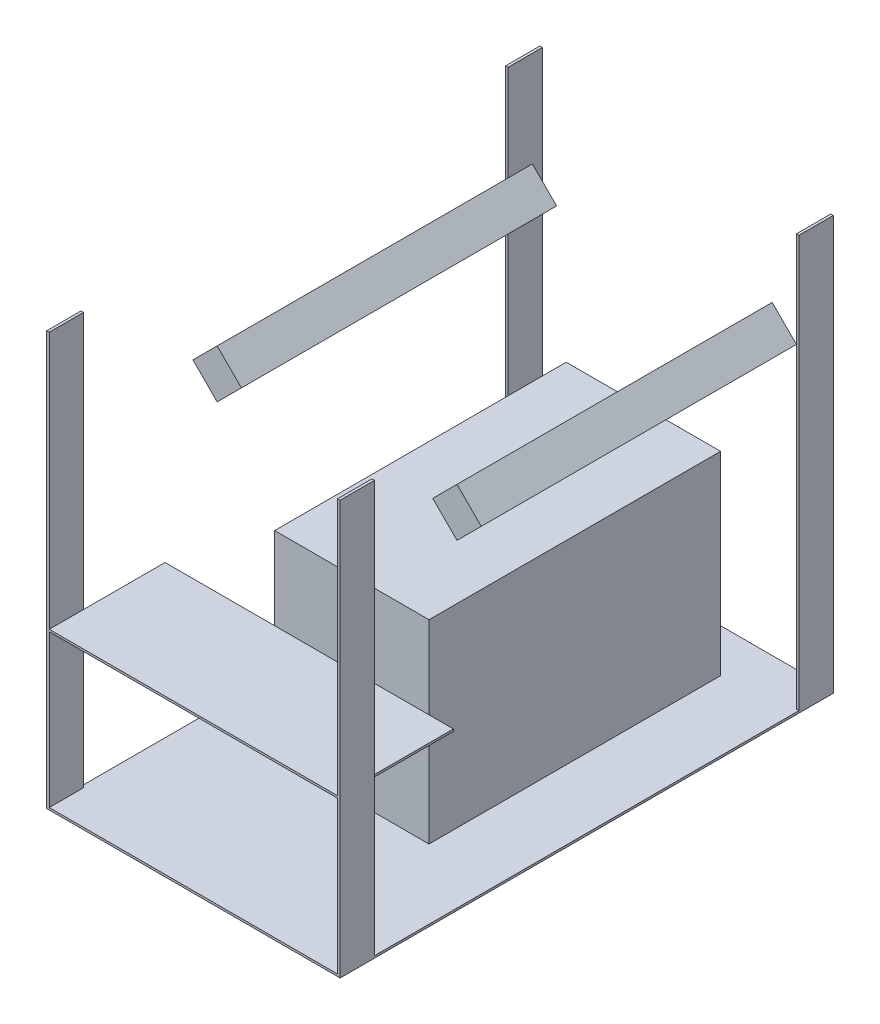
ISO-10303-21;
HEADER;
FILE_DESCRIPTION(('STEP AP214'),'2;1');
FILE_NAME('part.step','',(''),(''),'','','');
FILE_SCHEMA(('AUTOMOTIVE_DESIGN { 1 0 10303 214 1 1 1 1 }'));
ENDSEC;
DATA;
#1=APPLICATION_CONTEXT('core data for automotive mechanical design processes');
#2=APPLICATION_PROTOCOL_DEFINITION('international standard','automotive_design',2000,#1);
#3=PRODUCT_CONTEXT('',#1,'mechanical');
#4=PRODUCT('Part','Part','',(#3));
#5=PRODUCT_RELATED_PRODUCT_CATEGORY('part','',(#4));
#6=PRODUCT_DEFINITION_FORMATION('','',#4);
#7=PRODUCT_DEFINITION_CONTEXT('part definition',#1,'design');
#8=PRODUCT_DEFINITION('design','',#6,#7);
#9=PRODUCT_DEFINITION_SHAPE('','',#8);
#10=(LENGTH_UNIT() NAMED_UNIT(*) SI_UNIT(.MILLI.,.METRE.));
#11=(NAMED_UNIT(*) PLANE_ANGLE_UNIT() SI_UNIT($,.RADIAN.));
#12=(NAMED_UNIT(*) SI_UNIT($,.STERADIAN.) SOLID_ANGLE_UNIT());
#13=UNCERTAINTY_MEASURE_WITH_UNIT(LENGTH_MEASURE(1.E-05),#10,'distance_accuracy_value','');
#14=(GEOMETRIC_REPRESENTATION_CONTEXT(3) GLOBAL_UNCERTAINTY_ASSIGNED_CONTEXT((#13)) GLOBAL_UNIT_ASSIGNED_CONTEXT((#10,
#11,#12)) REPRESENTATION_CONTEXT('',''));
#15=CARTESIAN_POINT('',(0.,0.,0.));
#16=DIRECTION('',(0.,0.,1.));
#17=DIRECTION('',(1.,0.,0.));
#18=AXIS2_PLACEMENT_3D('',#15,#16,#17);
#19=CARTESIAN_POINT('',(217.297,612.775,-314.325));
#20=DIRECTION('',(0.,0.,-1.));
#21=DIRECTION('',(-1.,0.,0.));
#22=AXIS2_PLACEMENT_3D('',#19,#20,#21);
#23=PLANE('',#22);
#24=DIRECTION('',(0.707106781186552,0.707106781186543,0.));
#25=VECTOR('',#24,1.);
#26=CARTESIAN_POINT('',(-141.644951031447,470.896024484276,-314.325));
#27=LINE('',#26,#25);
#28=CARTESIAN_POINT('',(-177.565975515723,434.975,-314.325));
#29=VERTEX_POINT('',#28);
#30=CARTESIAN_POINT('',(-141.644951031447,470.896024484276,-314.325));
#31=VERTEX_POINT('',#30);
#32=EDGE_CURVE('E72',#29,#31,#27,.T.);
#33=ORIENTED_EDGE('',*,*,#32,.F.);
#34=DIRECTION('',(0.707106781186543,-0.707106781186552,0.));
#35=VECTOR('',#34,1.);
#36=CARTESIAN_POINT('',(-177.565975515723,434.975,-314.325));
#37=LINE('',#36,#35);
#38=CARTESIAN_POINT('',(-213.487,470.896024484277,-314.325));
#39=VERTEX_POINT('',#38);
#40=EDGE_CURVE('E96',#39,#29,#37,.T.);
#41=ORIENTED_EDGE('',*,*,#40,.F.);
#42=DIRECTION('',(-0.707106781186552,-0.707106781186543,0.));
#43=VECTOR('',#42,1.);
#44=CARTESIAN_POINT('',(-213.487,470.896024484277,-314.325));
#45=LINE('',#44,#43);
#46=CARTESIAN_POINT('',(-177.565975515723,506.817048968553,-314.325));
#47=VERTEX_POINT('',#46);
#48=EDGE_CURVE('E113',#47,#39,#45,.T.);
#49=ORIENTED_EDGE('',*,*,#48,.F.);
#50=DIRECTION('',(-0.707106781186542,0.707106781186553,0.));
#51=VECTOR('',#50,1.);
#52=CARTESIAN_POINT('',(-177.565975515723,506.817048968553,-314.325));
#53=LINE('',#52,#51);
#54=EDGE_CURVE('E108',#31,#47,#53,.T.);
#55=ORIENTED_EDGE('',*,*,#54,.F.);
#56=EDGE_LOOP('',(#33,#41,#49,#55));
#57=FACE_BOUND('',#56,.T.);
#58=ADVANCED_FACE('F53',(#57),#23,.T.);
#59=CARTESIAN_POINT('',(0.,0.,152.4));
#60=DIRECTION('',(0.,0.,-1.));
#61=DIRECTION('',(-1.,0.,0.));
#62=AXIS2_PLACEMENT_3D('',#59,#60,#61);
#63=PLANE('',#62);
#64=DIRECTION('',(0.707106781186552,0.707106781186543,0.));
#65=VECTOR('',#64,1.);
#66=CARTESIAN_POINT('',(-141.644951031447,470.896024484276,152.4));
#67=LINE('',#66,#65);
#68=CARTESIAN_POINT('',(-177.565975515723,434.975,152.4));
#69=VERTEX_POINT('',#68);
#70=CARTESIAN_POINT('',(-141.644951031447,470.896024484276,152.4));
#71=VERTEX_POINT('',#70);
#72=EDGE_CURVE('E12',#69,#71,#67,.T.);
#73=ORIENTED_EDGE('',*,*,#72,.T.);
#74=DIRECTION('',(-0.707106781186542,0.707106781186553,0.));
#75=VECTOR('',#74,1.);
#76=CARTESIAN_POINT('',(-177.565975515723,506.817048968553,152.4));
#77=LINE('',#76,#75);
#78=CARTESIAN_POINT('',(-177.565975515723,506.817048968553,152.4));
#79=VERTEX_POINT('',#78);
#80=EDGE_CURVE('E63',#71,#79,#77,.T.);
#81=ORIENTED_EDGE('',*,*,#80,.T.);
#82=DIRECTION('',(-0.707106781186552,-0.707106781186543,0.));
#83=VECTOR('',#82,1.);
#84=CARTESIAN_POINT('',(-213.487,470.896024484277,152.4));
#85=LINE('',#84,#83);
#86=CARTESIAN_POINT('',(-213.487,470.896024484277,152.4));
#87=VERTEX_POINT('',#86);
#88=EDGE_CURVE('E107',#79,#87,#85,.T.);
#89=ORIENTED_EDGE('',*,*,#88,.T.);
#90=DIRECTION('',(0.707106781186543,-0.707106781186552,0.));
#91=VECTOR('',#90,1.);
#92=CARTESIAN_POINT('',(-177.565975515723,434.975,152.4));
#93=LINE('',#92,#91);
#94=EDGE_CURVE('E57',#87,#69,#93,.T.);
#95=ORIENTED_EDGE('',*,*,#94,.T.);
#96=EDGE_LOOP('',(#73,#81,#89,#95));
#97=FACE_BOUND('',#96,.T.);
#98=ADVANCED_FACE('F55',(#97),#63,.F.);
#99=CARTESIAN_POINT('',(-177.565975515723,506.817048968553,-415.925));
#100=DIRECTION('',(0.707106781186553,0.707106781186542,0.));
#101=DIRECTION('',(-0.707106781186542,0.707106781186553,0.));
#102=AXIS2_PLACEMENT_3D('',#99,#100,#101);
#103=PLANE('',#102);
#104=DIRECTION('',(0.,0.,1.));
#105=VECTOR('',#104,1.);
#106=CARTESIAN_POINT('',(-141.644951031447,470.896024484276,-415.925));
#107=LINE('',#106,#105);
#108=EDGE_CURVE('E101',#31,#71,#107,.T.);
#109=ORIENTED_EDGE('',*,*,#108,.F.);
#110=ORIENTED_EDGE('',*,*,#54,.T.);
#111=DIRECTION('',(0.,0.,1.));
#112=VECTOR('',#111,1.);
#113=CARTESIAN_POINT('',(-177.565975515723,506.817048968553,-415.925));
#114=LINE('',#113,#112);
#115=EDGE_CURVE('E110',#47,#79,#114,.T.);
#116=ORIENTED_EDGE('',*,*,#115,.T.);
#117=ORIENTED_EDGE('',*,*,#80,.F.);
#118=EDGE_LOOP('',(#109,#110,#116,#117));
#119=FACE_BOUND('',#118,.T.);
#120=ADVANCED_FACE('F118',(#119),#103,.T.);
#121=CARTESIAN_POINT('',(-213.487,470.896024484277,-415.925));
#122=DIRECTION('',(-0.707106781186543,0.707106781186552,0.));
#123=DIRECTION('',(-0.707106781186552,-0.707106781186543,0.));
#124=AXIS2_PLACEMENT_3D('',#121,#122,#123);
#125=PLANE('',#124);
#126=ORIENTED_EDGE('',*,*,#115,.F.);
#127=ORIENTED_EDGE('',*,*,#48,.T.);
#128=DIRECTION('',(0.,0.,1.));
#129=VECTOR('',#128,1.);
#130=CARTESIAN_POINT('',(-213.487,470.896024484277,-415.925));
#131=LINE('',#130,#129);
#132=EDGE_CURVE('E123',#39,#87,#131,.T.);
#133=ORIENTED_EDGE('',*,*,#132,.T.);
#134=ORIENTED_EDGE('',*,*,#88,.F.);
#135=EDGE_LOOP('',(#126,#127,#133,#134));
#136=FACE_BOUND('',#135,.T.);
#137=ADVANCED_FACE('F122',(#136),#125,.T.);
#138=CARTESIAN_POINT('',(-177.565975515723,434.975,-415.925));
#139=DIRECTION('',(-0.707106781186552,-0.707106781186543,0.));
#140=DIRECTION('',(0.707106781186543,-0.707106781186552,0.));
#141=AXIS2_PLACEMENT_3D('',#138,#139,#140);
#142=PLANE('',#141);
#143=ORIENTED_EDGE('',*,*,#132,.F.);
#144=ORIENTED_EDGE('',*,*,#40,.T.);
#145=DIRECTION('',(0.,0.,1.));
#146=VECTOR('',#145,1.);
#147=CARTESIAN_POINT('',(-177.565975515723,434.975,-415.925));
#148=LINE('',#147,#146);
#149=EDGE_CURVE('E91',#29,#69,#148,.T.);
#150=ORIENTED_EDGE('',*,*,#149,.T.);
#151=ORIENTED_EDGE('',*,*,#94,.F.);
#152=EDGE_LOOP('',(#143,#144,#150,#151));
#153=FACE_BOUND('',#152,.T.);
#154=ADVANCED_FACE('F94',(#153),#142,.T.);
#155=CARTESIAN_POINT('',(-141.644951031447,470.896024484276,-415.925));
#156=DIRECTION('',(0.707106781186543,-0.707106781186552,0.));
#157=DIRECTION('',(0.707106781186552,0.707106781186543,0.));
#158=AXIS2_PLACEMENT_3D('',#155,#156,#157);
#159=PLANE('',#158);
#160=ORIENTED_EDGE('',*,*,#149,.F.);
#161=ORIENTED_EDGE('',*,*,#32,.T.);
#162=ORIENTED_EDGE('',*,*,#108,.T.);
#163=ORIENTED_EDGE('',*,*,#72,.F.);
#164=EDGE_LOOP('',(#160,#161,#162,#163));
#165=FACE_BOUND('',#164,.T.);
#166=ADVANCED_FACE('F99',(#165),#159,.T.);
#167=CLOSED_SHELL('',(#58,#98,#120,#137,#154,#166));
#168=MANIFOLD_SOLID_BREP('B2',#167);
#169=CARTESIAN_POINT('',(217.297,612.775,-314.325));
#170=DIRECTION('',(0.,0.,-1.));
#171=DIRECTION('',(-1.,0.,0.));
#172=AXIS2_PLACEMENT_3D('',#169,#170,#171);
#173=PLANE('',#172);
#174=DIRECTION('',(-0.707106781186551,0.707106781186544,0.));
#175=VECTOR('',#174,1.);
#176=CARTESIAN_POINT('',(213.487,470.896024484277,-314.325));
#177=LINE('',#176,#175);
#178=CARTESIAN_POINT('',(213.487,470.896024484277,-314.325));
#179=VERTEX_POINT('',#178);
#180=CARTESIAN_POINT('',(177.565975515723,506.817048968553,-314.325));
#181=VERTEX_POINT('',#180);
#182=EDGE_CURVE('E193',#179,#181,#177,.T.);
#183=ORIENTED_EDGE('',*,*,#182,.F.);
#184=DIRECTION('',(0.707106781186543,0.707106781186552,0.));
#185=VECTOR('',#184,1.);
#186=CARTESIAN_POINT('',(177.565975515723,434.975,-314.325));
#187=LINE('',#186,#185);
#188=CARTESIAN_POINT('',(177.565975515723,434.975,-314.325));
#189=VERTEX_POINT('',#188);
#190=EDGE_CURVE('E216',#189,#179,#187,.T.);
#191=ORIENTED_EDGE('',*,*,#190,.F.);
#192=DIRECTION('',(0.707106781186551,-0.707106781186544,0.));
#193=VECTOR('',#192,1.);
#194=CARTESIAN_POINT('',(141.644951031447,470.896024484276,-314.325));
#195=LINE('',#194,#193);
#196=CARTESIAN_POINT('',(141.644951031447,470.896024484276,-314.325));
#197=VERTEX_POINT('',#196);
#198=EDGE_CURVE('E221',#197,#189,#195,.T.);
#199=ORIENTED_EDGE('',*,*,#198,.F.);
#200=DIRECTION('',(-0.70710678118654,-0.707106781186555,0.));
#201=VECTOR('',#200,1.);
#202=CARTESIAN_POINT('',(177.565975515723,506.817048968553,-314.325));
#203=LINE('',#202,#201);
#204=EDGE_CURVE('E236',#181,#197,#203,.T.);
#205=ORIENTED_EDGE('',*,*,#204,.F.);
#206=EDGE_LOOP('',(#183,#191,#199,#205));
#207=FACE_BOUND('',#206,.T.);
#208=ADVANCED_FACE('F185',(#207),#173,.T.);
#209=CARTESIAN_POINT('',(0.,0.,152.4));
#210=DIRECTION('',(0.,0.,1.));
#211=DIRECTION('',(1.,0.,0.));
#212=AXIS2_PLACEMENT_3D('',#209,#210,#211);
#213=PLANE('',#212);
#214=DIRECTION('',(-0.707106781186551,0.707106781186544,0.));
#215=VECTOR('',#214,1.);
#216=CARTESIAN_POINT('',(213.487,470.896024484277,152.4));
#217=LINE('',#216,#215);
#218=CARTESIAN_POINT('',(213.487,470.896024484277,152.4));
#219=VERTEX_POINT('',#218);
#220=CARTESIAN_POINT('',(177.565975515723,506.817048968553,152.4));
#221=VERTEX_POINT('',#220);
#222=EDGE_CURVE('E245',#219,#221,#217,.T.);
#223=ORIENTED_EDGE('',*,*,#222,.T.);
#224=DIRECTION('',(-0.70710678118654,-0.707106781186555,0.));
#225=VECTOR('',#224,1.);
#226=CARTESIAN_POINT('',(177.565975515723,506.817048968553,152.4));
#227=LINE('',#226,#225);
#228=CARTESIAN_POINT('',(141.644951031447,470.896024484276,152.4));
#229=VERTEX_POINT('',#228);
#230=EDGE_CURVE('E234',#221,#229,#227,.T.);
#231=ORIENTED_EDGE('',*,*,#230,.T.);
#232=DIRECTION('',(0.707106781186551,-0.707106781186544,0.));
#233=VECTOR('',#232,1.);
#234=CARTESIAN_POINT('',(141.644951031447,470.896024484276,152.4));
#235=LINE('',#234,#233);
#236=CARTESIAN_POINT('',(177.565975515723,434.975,152.4));
#237=VERTEX_POINT('',#236);
#238=EDGE_CURVE('E237',#229,#237,#235,.T.);
#239=ORIENTED_EDGE('',*,*,#238,.T.);
#240=DIRECTION('',(0.707106781186543,0.707106781186552,0.));
#241=VECTOR('',#240,1.);
#242=CARTESIAN_POINT('',(177.565975515723,434.975,152.4));
#243=LINE('',#242,#241);
#244=EDGE_CURVE('E242',#237,#219,#243,.T.);
#245=ORIENTED_EDGE('',*,*,#244,.T.);
#246=EDGE_LOOP('',(#223,#231,#239,#245));
#247=FACE_BOUND('',#246,.T.);
#248=ADVANCED_FACE('F244',(#247),#213,.T.);
#249=CARTESIAN_POINT('',(177.565975515723,506.817048968553,-415.925));
#250=DIRECTION('',(-0.707106781186555,0.70710678118654,0.));
#251=DIRECTION('',(-0.70710678118654,-0.707106781186555,0.));
#252=AXIS2_PLACEMENT_3D('',#249,#250,#251);
#253=PLANE('',#252);
#254=DIRECTION('',(0.,0.,1.));
#255=VECTOR('',#254,1.);
#256=CARTESIAN_POINT('',(177.565975515723,506.817048968553,-415.925));
#257=LINE('',#256,#255);
#258=EDGE_CURVE('E51',#181,#221,#257,.T.);
#259=ORIENTED_EDGE('',*,*,#258,.F.);
#260=ORIENTED_EDGE('',*,*,#204,.T.);
#261=DIRECTION('',(0.,0.,1.));
#262=VECTOR('',#261,1.);
#263=CARTESIAN_POINT('',(141.644951031447,470.896024484276,-415.925));
#264=LINE('',#263,#262);
#265=EDGE_CURVE('E231',#197,#229,#264,.T.);
#266=ORIENTED_EDGE('',*,*,#265,.T.);
#267=ORIENTED_EDGE('',*,*,#230,.F.);
#268=EDGE_LOOP('',(#259,#260,#266,#267));
#269=FACE_BOUND('',#268,.T.);
#270=ADVANCED_FACE('F232',(#269),#253,.T.);
#271=CARTESIAN_POINT('',(141.644951031447,470.896024484276,-415.925));
#272=DIRECTION('',(-0.707106781186544,-0.707106781186551,0.));
#273=DIRECTION('',(0.707106781186551,-0.707106781186544,0.));
#274=AXIS2_PLACEMENT_3D('',#271,#272,#273);
#275=PLANE('',#274);
#276=ORIENTED_EDGE('',*,*,#265,.F.);
#277=ORIENTED_EDGE('',*,*,#198,.T.);
#278=DIRECTION('',(0.,0.,1.));
#279=VECTOR('',#278,1.);
#280=CARTESIAN_POINT('',(177.565975515723,434.975,-415.925));
#281=LINE('',#280,#279);
#282=EDGE_CURVE('E226',#189,#237,#281,.T.);
#283=ORIENTED_EDGE('',*,*,#282,.T.);
#284=ORIENTED_EDGE('',*,*,#238,.F.);
#285=EDGE_LOOP('',(#276,#277,#283,#284));
#286=FACE_BOUND('',#285,.T.);
#287=ADVANCED_FACE('F238',(#286),#275,.T.);
#288=CARTESIAN_POINT('',(177.565975515723,434.975,-415.925));
#289=DIRECTION('',(0.707106781186552,-0.707106781186543,0.));
#290=DIRECTION('',(0.707106781186543,0.707106781186552,0.));
#291=AXIS2_PLACEMENT_3D('',#288,#289,#290);
#292=PLANE('',#291);
#293=ORIENTED_EDGE('',*,*,#282,.F.);
#294=ORIENTED_EDGE('',*,*,#190,.T.);
#295=DIRECTION('',(0.,0.,1.));
#296=VECTOR('',#295,1.);
#297=CARTESIAN_POINT('',(213.487,470.896024484277,-415.925));
#298=LINE('',#297,#296);
#299=EDGE_CURVE('E252',#179,#219,#298,.T.);
#300=ORIENTED_EDGE('',*,*,#299,.T.);
#301=ORIENTED_EDGE('',*,*,#244,.F.);
#302=EDGE_LOOP('',(#293,#294,#300,#301));
#303=FACE_BOUND('',#302,.T.);
#304=ADVANCED_FACE('F258',(#303),#292,.T.);
#305=CARTESIAN_POINT('',(213.487,470.896024484277,-415.925));
#306=DIRECTION('',(0.707106781186544,0.707106781186551,0.));
#307=DIRECTION('',(-0.707106781186551,0.707106781186544,0.));
#308=AXIS2_PLACEMENT_3D('',#305,#306,#307);
#309=PLANE('',#308);
#310=ORIENTED_EDGE('',*,*,#299,.F.);
#311=ORIENTED_EDGE('',*,*,#182,.T.);
#312=ORIENTED_EDGE('',*,*,#258,.T.);
#313=ORIENTED_EDGE('',*,*,#222,.F.);
#314=EDGE_LOOP('',(#310,#311,#312,#313));
#315=FACE_BOUND('',#314,.T.);
#316=ADVANCED_FACE('F259',(#315),#309,.T.);
#317=CLOSED_SHELL('',(#208,#248,#270,#287,#304,#316));
#318=MANIFOLD_SOLID_BREP('B6',#317);
#319=CARTESIAN_POINT('',(0.,3.175,0.));
#320=DIRECTION('',(0.,1.,0.));
#321=DIRECTION('',(0.,0.,1.));
#322=AXIS2_PLACEMENT_3D('',#319,#320,#321);
#323=PLANE('',#322);
#324=DIRECTION('',(0.,0.,-1.));
#325=VECTOR('',#324,1.);
#326=CARTESIAN_POINT('',(-213.487,3.175,-365.125));
#327=LINE('',#326,#325);
#328=CARTESIAN_POINT('',(-213.487,3.175,-314.325));
#329=VERTEX_POINT('',#328);
#330=CARTESIAN_POINT('',(-213.487,3.175,-365.125));
#331=VERTEX_POINT('',#330);
#332=EDGE_CURVE('E604',#329,#331,#327,.T.);
#333=ORIENTED_EDGE('',*,*,#332,.F.);
#334=DIRECTION('',(1.,0.,0.));
#335=VECTOR('',#334,1.);
#336=CARTESIAN_POINT('',(-217.297,3.175,-314.325));
#337=LINE('',#336,#335);
#338=CARTESIAN_POINT('',(-217.297,3.175,-314.325));
#339=VERTEX_POINT('',#338);
#340=EDGE_CURVE('E574',#339,#329,#337,.T.);
#341=ORIENTED_EDGE('',*,*,#340,.F.);
#342=DIRECTION('',(0.,0.,1.));
#343=VECTOR('',#342,1.);
#344=CARTESIAN_POINT('',(-217.297,3.175,-365.125));
#345=LINE('',#344,#343);
#346=CARTESIAN_POINT('',(-217.297,3.175,314.325));
#347=VERTEX_POINT('',#346);
#348=EDGE_CURVE('E650',#339,#347,#345,.T.);
#349=ORIENTED_EDGE('',*,*,#348,.T.);
#350=DIRECTION('',(-1.,0.,0.));
#351=VECTOR('',#350,1.);
#352=CARTESIAN_POINT('',(-217.297,3.175,314.325));
#353=LINE('',#352,#351);
#354=CARTESIAN_POINT('',(-213.487,3.175,314.325));
#355=VERTEX_POINT('',#354);
#356=EDGE_CURVE('E622',#355,#347,#353,.T.);
#357=ORIENTED_EDGE('',*,*,#356,.F.);
#358=DIRECTION('',(0.,0.,-1.));
#359=VECTOR('',#358,1.);
#360=CARTESIAN_POINT('',(-213.487,3.175,365.125));
#361=LINE('',#360,#359);
#362=CARTESIAN_POINT('',(-213.487,3.175,365.125));
#363=VERTEX_POINT('',#362);
#364=EDGE_CURVE('E561',#363,#355,#361,.T.);
#365=ORIENTED_EDGE('',*,*,#364,.F.);
#366=DIRECTION('',(1.,0.,0.));
#367=VECTOR('',#366,1.);
#368=CARTESIAN_POINT('',(-217.297,3.175,365.125));
#369=LINE('',#368,#367);
#370=CARTESIAN_POINT('',(213.487,3.175,365.125));
#371=VERTEX_POINT('',#370);
#372=EDGE_CURVE('E652',#363,#371,#369,.T.);
#373=ORIENTED_EDGE('',*,*,#372,.T.);
#374=DIRECTION('',(0.,0.,1.));
#375=VECTOR('',#374,1.);
#376=CARTESIAN_POINT('',(213.487,3.175,365.125));
#377=LINE('',#376,#375);
#378=CARTESIAN_POINT('',(213.487,3.175,314.325));
#379=VERTEX_POINT('',#378);
#380=EDGE_CURVE('E554',#379,#371,#377,.T.);
#381=ORIENTED_EDGE('',*,*,#380,.F.);
#382=DIRECTION('',(-1.,0.,0.));
#383=VECTOR('',#382,1.);
#384=CARTESIAN_POINT('',(217.297,3.175,314.325));
#385=LINE('',#384,#383);
#386=CARTESIAN_POINT('',(217.297,3.175,314.325));
#387=VERTEX_POINT('',#386);
#388=EDGE_CURVE('E557',#387,#379,#385,.T.);
#389=ORIENTED_EDGE('',*,*,#388,.F.);
#390=DIRECTION('',(0.,0.,-1.));
#391=VECTOR('',#390,1.);
#392=CARTESIAN_POINT('',(217.297,3.175,-365.125));
#393=LINE('',#392,#391);
#394=CARTESIAN_POINT('',(217.297,3.175,-314.325));
#395=VERTEX_POINT('',#394);
#396=EDGE_CURVE('E645',#387,#395,#393,.T.);
#397=ORIENTED_EDGE('',*,*,#396,.T.);
#398=DIRECTION('',(1.,0.,0.));
#399=VECTOR('',#398,1.);
#400=CARTESIAN_POINT('',(217.297,3.175,-314.325));
#401=LINE('',#400,#399);
#402=CARTESIAN_POINT('',(213.487,3.175,-314.325));
#403=VERTEX_POINT('',#402);
#404=EDGE_CURVE('E581',#403,#395,#401,.T.);
#405=ORIENTED_EDGE('',*,*,#404,.F.);
#406=DIRECTION('',(0.,0.,1.));
#407=VECTOR('',#406,1.);
#408=CARTESIAN_POINT('',(213.487,3.175,-365.125));
#409=LINE('',#408,#407);
#410=CARTESIAN_POINT('',(213.487,3.175,-365.125));
#411=VERTEX_POINT('',#410);
#412=EDGE_CURVE('E544',#411,#403,#409,.T.);
#413=ORIENTED_EDGE('',*,*,#412,.F.);
#414=DIRECTION('',(-1.,0.,0.));
#415=VECTOR('',#414,1.);
#416=CARTESIAN_POINT('',(-217.297,3.175,-365.125));
#417=LINE('',#416,#415);
#418=EDGE_CURVE('E647',#411,#331,#417,.T.);
#419=ORIENTED_EDGE('',*,*,#418,.T.);
#420=EDGE_LOOP('',(#333,#341,#349,#357,#365,#373,#381,#389,#397,#405,#413,#419));
#421=FACE_BOUND('',#420,.T.);
#422=DIRECTION('',(-1.,0.,0.));
#423=VECTOR('',#422,1.);
#424=CARTESIAN_POINT('',(-114.173,3.175,-301.117));
#425=LINE('',#424,#423);
#426=CARTESIAN_POINT('',(114.427,3.175,-301.117));
#427=VERTEX_POINT('',#426);
#428=CARTESIAN_POINT('',(-114.173,3.175,-301.117));
#429=VERTEX_POINT('',#428);
#430=EDGE_CURVE('E1040',#427,#429,#425,.T.);
#431=ORIENTED_EDGE('',*,*,#430,.F.);
#432=DIRECTION('',(0.,0.,-1.));
#433=VECTOR('',#432,1.);
#434=CARTESIAN_POINT('',(114.427,3.175,-301.117));
#435=LINE('',#434,#433);
#436=CARTESIAN_POINT('',(114.427,3.175,130.683));
#437=VERTEX_POINT('',#436);
#438=EDGE_CURVE('E505',#437,#427,#435,.T.);
#439=ORIENTED_EDGE('',*,*,#438,.F.);
#440=DIRECTION('',(1.,0.,0.));
#441=VECTOR('',#440,1.);
#442=CARTESIAN_POINT('',(-114.173,3.175,130.683));
#443=LINE('',#442,#441);
#444=CARTESIAN_POINT('',(-114.173,3.175,130.683));
#445=VERTEX_POINT('',#444);
#446=EDGE_CURVE('E501',#445,#437,#443,.T.);
#447=ORIENTED_EDGE('',*,*,#446,.F.);
#448=DIRECTION('',(0.,0.,1.));
#449=VECTOR('',#448,1.);
#450=CARTESIAN_POINT('',(-114.173,3.175,-301.117));
#451=LINE('',#450,#449);
#452=EDGE_CURVE('E1037',#429,#445,#451,.T.);
#453=ORIENTED_EDGE('',*,*,#452,.F.);
#454=EDGE_LOOP('',(#431,#439,#447,#453));
#455=FACE_BOUND('',#454,.T.);
#456=ADVANCED_FACE('F308',(#421,#455),#323,.T.);
#457=CARTESIAN_POINT('',(-213.487,612.775,365.125));
#458=DIRECTION('',(-1.,0.,0.));
#459=DIRECTION('',(0.,0.,1.));
#460=AXIS2_PLACEMENT_3D('',#457,#458,#459);
#461=PLANE('',#460);
#462=DIRECTION('',(0.,0.,1.));
#463=VECTOR('',#462,1.);
#464=CARTESIAN_POINT('',(-213.487,231.775,365.125));
#465=LINE('',#464,#463);
#466=CARTESIAN_POINT('',(-213.487,231.775,314.325));
#467=VERTEX_POINT('',#466);
#468=CARTESIAN_POINT('',(-213.487,231.775,365.125));
#469=VERTEX_POINT('',#468);
#470=EDGE_CURVE('E518',#467,#469,#465,.T.);
#471=ORIENTED_EDGE('',*,*,#470,.F.);
#472=DIRECTION('',(0.,-1.,0.));
#473=VECTOR('',#472,1.);
#474=CARTESIAN_POINT('',(-213.487,612.775,314.325));
#475=LINE('',#474,#473);
#476=CARTESIAN_POINT('',(-213.487,612.775,314.325));
#477=VERTEX_POINT('',#476);
#478=EDGE_CURVE('E636',#477,#467,#475,.T.);
#479=ORIENTED_EDGE('',*,*,#478,.F.);
#480=DIRECTION('',(0.,0.,-1.));
#481=VECTOR('',#480,1.);
#482=CARTESIAN_POINT('',(-213.487,612.775,365.125));
#483=LINE('',#482,#481);
#484=CARTESIAN_POINT('',(-213.487,612.775,365.125));
#485=VERTEX_POINT('',#484);
#486=EDGE_CURVE('E624',#485,#477,#483,.T.);
#487=ORIENTED_EDGE('',*,*,#486,.F.);
#488=DIRECTION('',(0.,-1.,0.));
#489=VECTOR('',#488,1.);
#490=CARTESIAN_POINT('',(-213.487,612.775,365.125));
#491=LINE('',#490,#489);
#492=EDGE_CURVE('E641',#485,#469,#491,.T.);
#493=ORIENTED_EDGE('',*,*,#492,.T.);
#494=EDGE_LOOP('',(#471,#479,#487,#493));
#495=FACE_BOUND('',#494,.T.);
#496=ADVANCED_FACE('F730',(#495),#461,.F.);
#497=CARTESIAN_POINT('',(213.487,612.775,365.125));
#498=DIRECTION('',(1.,0.,0.));
#499=DIRECTION('',(0.,0.,-1.));
#500=AXIS2_PLACEMENT_3D('',#497,#498,#499);
#501=PLANE('',#500);
#502=DIRECTION('',(0.,0.,-1.));
#503=VECTOR('',#502,1.);
#504=CARTESIAN_POINT('',(213.487,231.775,365.125));
#505=LINE('',#504,#503);
#506=CARTESIAN_POINT('',(213.487,231.775,365.125));
#507=VERTEX_POINT('',#506);
#508=CARTESIAN_POINT('',(213.487,231.775,314.325));
#509=VERTEX_POINT('',#508);
#510=EDGE_CURVE('E521',#507,#509,#505,.T.);
#511=ORIENTED_EDGE('',*,*,#510,.F.);
#512=DIRECTION('',(0.,-1.,0.));
#513=VECTOR('',#512,1.);
#514=CARTESIAN_POINT('',(213.487,612.775,365.125));
#515=LINE('',#514,#513);
#516=CARTESIAN_POINT('',(213.487,612.775,365.125));
#517=VERTEX_POINT('',#516);
#518=EDGE_CURVE('E550',#517,#507,#515,.T.);
#519=ORIENTED_EDGE('',*,*,#518,.F.);
#520=DIRECTION('',(0.,0.,1.));
#521=VECTOR('',#520,1.);
#522=CARTESIAN_POINT('',(213.487,612.775,365.125));
#523=LINE('',#522,#521);
#524=CARTESIAN_POINT('',(213.487,612.775,314.325));
#525=VERTEX_POINT('',#524);
#526=EDGE_CURVE('E564',#525,#517,#523,.T.);
#527=ORIENTED_EDGE('',*,*,#526,.F.);
#528=DIRECTION('',(0.,-1.,0.));
#529=VECTOR('',#528,1.);
#530=CARTESIAN_POINT('',(213.487,612.775,314.325));
#531=LINE('',#530,#529);
#532=EDGE_CURVE('E545',#525,#509,#531,.T.);
#533=ORIENTED_EDGE('',*,*,#532,.T.);
#534=EDGE_LOOP('',(#511,#519,#527,#533));
#535=FACE_BOUND('',#534,.T.);
#536=ADVANCED_FACE('F696',(#535),#501,.F.);
#537=CARTESIAN_POINT('',(217.297,3.175,-365.125));
#538=DIRECTION('',(-1.,0.,0.));
#539=DIRECTION('',(0.,0.,1.));
#540=AXIS2_PLACEMENT_3D('',#537,#538,#539);
#541=PLANE('',#540);
#542=DIRECTION('',(0.,0.,-1.));
#543=VECTOR('',#542,1.);
#544=CARTESIAN_POINT('',(217.297,0.,-365.125));
#545=LINE('',#544,#543);
#546=CARTESIAN_POINT('',(217.297,0.,365.125));
#547=VERTEX_POINT('',#546);
#548=CARTESIAN_POINT('',(217.297,0.,-365.125));
#549=VERTEX_POINT('',#548);
#550=EDGE_CURVE('E644',#547,#549,#545,.T.);
#551=ORIENTED_EDGE('',*,*,#550,.T.);
#552=DIRECTION('',(0.,-1.,0.));
#553=VECTOR('',#552,1.);
#554=CARTESIAN_POINT('',(217.297,3.175,-365.125));
#555=LINE('',#554,#553);
#556=CARTESIAN_POINT('',(217.297,612.775,-365.125));
#557=VERTEX_POINT('',#556);
#558=EDGE_CURVE('E183',#557,#549,#555,.T.);
#559=ORIENTED_EDGE('',*,*,#558,.F.);
#560=DIRECTION('',(0.,0.,-1.));
#561=VECTOR('',#560,1.);
#562=CARTESIAN_POINT('',(217.297,612.775,-365.125));
#563=LINE('',#562,#561);
#564=CARTESIAN_POINT('',(217.297,612.775,-314.325));
#565=VERTEX_POINT('',#564);
#566=EDGE_CURVE('E580',#565,#557,#563,.T.);
#567=ORIENTED_EDGE('',*,*,#566,.F.);
#568=DIRECTION('',(0.,-1.,0.));
#569=VECTOR('',#568,1.);
#570=CARTESIAN_POINT('',(217.297,612.775,-314.325));
#571=LINE('',#570,#569);
#572=EDGE_CURVE('E577',#565,#395,#571,.T.);
#573=ORIENTED_EDGE('',*,*,#572,.T.);
#574=ORIENTED_EDGE('',*,*,#396,.F.);
#575=DIRECTION('',(0.,-1.,0.));
#576=VECTOR('',#575,1.);
#577=CARTESIAN_POINT('',(217.297,612.775,314.325));
#578=LINE('',#577,#576);
#579=CARTESIAN_POINT('',(217.297,612.775,314.325));
#580=VERTEX_POINT('',#579);
#581=EDGE_CURVE('E540',#580,#387,#578,.T.);
#582=ORIENTED_EDGE('',*,*,#581,.F.);
#583=DIRECTION('',(0.,0.,-1.));
#584=VECTOR('',#583,1.);
#585=CARTESIAN_POINT('',(217.297,612.775,365.125));
#586=LINE('',#585,#584);
#587=CARTESIAN_POINT('',(217.297,612.775,365.125));
#588=VERTEX_POINT('',#587);
#589=EDGE_CURVE('E558',#588,#580,#586,.T.);
#590=ORIENTED_EDGE('',*,*,#589,.F.);
#591=DIRECTION('',(0.,-1.,0.));
#592=VECTOR('',#591,1.);
#593=CARTESIAN_POINT('',(217.297,3.175,365.125));
#594=LINE('',#593,#592);
#595=EDGE_CURVE('E655',#588,#547,#594,.T.);
#596=ORIENTED_EDGE('',*,*,#595,.T.);
#597=EDGE_LOOP('',(#551,#559,#567,#573,#574,#582,#590,#596));
#598=FACE_BOUND('',#597,.T.);
#599=ADVANCED_FACE('F310',(#598),#541,.F.);
#600=CARTESIAN_POINT('',(-217.297,3.175,-365.125));
#601=DIRECTION('',(0.,0.,1.));
#602=DIRECTION('',(1.,0.,0.));
#603=AXIS2_PLACEMENT_3D('',#600,#601,#602);
#604=PLANE('',#603);
#605=DIRECTION('',(-1.,0.,0.));
#606=VECTOR('',#605,1.);
#607=CARTESIAN_POINT('',(-217.297,0.,-365.125));
#608=LINE('',#607,#606);
#609=CARTESIAN_POINT('',(-217.297,0.,-365.125));
#610=VERTEX_POINT('',#609);
#611=EDGE_CURVE('E658',#549,#610,#608,.T.);
#612=ORIENTED_EDGE('',*,*,#611,.T.);
#613=DIRECTION('',(0.,-1.,0.));
#614=VECTOR('',#613,1.);
#615=CARTESIAN_POINT('',(-217.297,3.175,-365.125));
#616=LINE('',#615,#614);
#617=CARTESIAN_POINT('',(-217.297,612.775,-365.125));
#618=VERTEX_POINT('',#617);
#619=EDGE_CURVE('E316',#618,#610,#616,.T.);
#620=ORIENTED_EDGE('',*,*,#619,.F.);
#621=DIRECTION('',(-1.,0.,0.));
#622=VECTOR('',#621,1.);
#623=CARTESIAN_POINT('',(-217.297,612.775,-365.125));
#624=LINE('',#623,#622);
#625=CARTESIAN_POINT('',(-213.487,612.775,-365.125));
#626=VERTEX_POINT('',#625);
#627=EDGE_CURVE('E603',#626,#618,#624,.T.);
#628=ORIENTED_EDGE('',*,*,#627,.F.);
#629=DIRECTION('',(0.,-1.,0.));
#630=VECTOR('',#629,1.);
#631=CARTESIAN_POINT('',(-213.487,612.775,-365.125));
#632=LINE('',#631,#630);
#633=EDGE_CURVE('E600',#626,#331,#632,.T.);
#634=ORIENTED_EDGE('',*,*,#633,.T.);
#635=ORIENTED_EDGE('',*,*,#418,.F.);
#636=DIRECTION('',(0.,-1.,0.));
#637=VECTOR('',#636,1.);
#638=CARTESIAN_POINT('',(213.487,612.775,-365.125));
#639=LINE('',#638,#637);
#640=CARTESIAN_POINT('',(213.487,612.775,-365.125));
#641=VERTEX_POINT('',#640);
#642=EDGE_CURVE('E570',#641,#411,#639,.T.);
#643=ORIENTED_EDGE('',*,*,#642,.F.);
#644=DIRECTION('',(-1.,0.,0.));
#645=VECTOR('',#644,1.);
#646=CARTESIAN_POINT('',(217.297,612.775,-365.125));
#647=LINE('',#646,#645);
#648=EDGE_CURVE('E584',#557,#641,#647,.T.);
#649=ORIENTED_EDGE('',*,*,#648,.F.);
#650=ORIENTED_EDGE('',*,*,#558,.T.);
#651=EDGE_LOOP('',(#612,#620,#628,#634,#635,#643,#649,#650));
#652=FACE_BOUND('',#651,.T.);
#653=ADVANCED_FACE('F748',(#652),#604,.F.);
#654=CARTESIAN_POINT('',(-217.297,3.175,-365.125));
#655=DIRECTION('',(1.,0.,0.));
#656=DIRECTION('',(0.,0.,-1.));
#657=AXIS2_PLACEMENT_3D('',#654,#655,#656);
#658=PLANE('',#657);
#659=DIRECTION('',(0.,0.,1.));
#660=VECTOR('',#659,1.);
#661=CARTESIAN_POINT('',(-217.297,0.,-365.125));
#662=LINE('',#661,#660);
#663=CARTESIAN_POINT('',(-217.297,0.,365.125));
#664=VERTEX_POINT('',#663);
#665=EDGE_CURVE('E660',#610,#664,#662,.T.);
#666=ORIENTED_EDGE('',*,*,#665,.T.);
#667=DIRECTION('',(0.,-1.,0.));
#668=VECTOR('',#667,1.);
#669=CARTESIAN_POINT('',(-217.297,3.175,365.125));
#670=LINE('',#669,#668);
#671=CARTESIAN_POINT('',(-217.297,612.775,365.125));
#672=VERTEX_POINT('',#671);
#673=EDGE_CURVE('E665',#672,#664,#670,.T.);
#674=ORIENTED_EDGE('',*,*,#673,.F.);
#675=DIRECTION('',(0.,0.,1.));
#676=VECTOR('',#675,1.);
#677=CARTESIAN_POINT('',(-217.297,612.775,365.125));
#678=LINE('',#677,#676);
#679=CARTESIAN_POINT('',(-217.297,612.775,314.325));
#680=VERTEX_POINT('',#679);
#681=EDGE_CURVE('E618',#680,#672,#678,.T.);
#682=ORIENTED_EDGE('',*,*,#681,.F.);
#683=DIRECTION('',(0.,-1.,0.));
#684=VECTOR('',#683,1.);
#685=CARTESIAN_POINT('',(-217.297,612.775,314.325));
#686=LINE('',#685,#684);
#687=EDGE_CURVE('E628',#680,#347,#686,.T.);
#688=ORIENTED_EDGE('',*,*,#687,.T.);
#689=ORIENTED_EDGE('',*,*,#348,.F.);
#690=DIRECTION('',(0.,-1.,0.));
#691=VECTOR('',#690,1.);
#692=CARTESIAN_POINT('',(-217.297,612.775,-314.325));
#693=LINE('',#692,#691);
#694=CARTESIAN_POINT('',(-217.297,612.775,-314.325));
#695=VERTEX_POINT('',#694);
#696=EDGE_CURVE('E539',#695,#339,#693,.T.);
#697=ORIENTED_EDGE('',*,*,#696,.F.);
#698=DIRECTION('',(0.,0.,1.));
#699=VECTOR('',#698,1.);
#700=CARTESIAN_POINT('',(-217.297,612.775,-365.125));
#701=LINE('',#700,#699);
#702=EDGE_CURVE('E607',#618,#695,#701,.T.);
#703=ORIENTED_EDGE('',*,*,#702,.F.);
#704=ORIENTED_EDGE('',*,*,#619,.T.);
#705=EDGE_LOOP('',(#666,#674,#682,#688,#689,#697,#703,#704));
#706=FACE_BOUND('',#705,.T.);
#707=ADVANCED_FACE('F671',(#706),#658,.F.);
#708=CARTESIAN_POINT('',(-217.297,3.175,365.125));
#709=DIRECTION('',(0.,0.,-1.));
#710=DIRECTION('',(-1.,0.,0.));
#711=AXIS2_PLACEMENT_3D('',#708,#709,#710);
#712=PLANE('',#711);
#713=CARTESIAN_POINT('',(-213.487,228.6,365.125));
#714=VERTEX_POINT('',#713);
#715=EDGE_CURVE('E639',#714,#363,#491,.T.);
#716=ORIENTED_EDGE('',*,*,#715,.F.);
#717=DIRECTION('',(1.,0.,0.));
#718=VECTOR('',#717,1.);
#719=CARTESIAN_POINT('',(-213.487,228.6,365.125));
#720=LINE('',#719,#718);
#721=CARTESIAN_POINT('',(213.487,228.6,365.125));
#722=VERTEX_POINT('',#721);
#723=EDGE_CURVE('E527',#714,#722,#720,.T.);
#724=ORIENTED_EDGE('',*,*,#723,.T.);
#725=EDGE_CURVE('E548',#722,#371,#515,.T.);
#726=ORIENTED_EDGE('',*,*,#725,.T.);
#727=ORIENTED_EDGE('',*,*,#372,.F.);
#728=EDGE_LOOP('',(#716,#724,#726,#727));
#729=FACE_BOUND('',#728,.T.);
#730=DIRECTION('',(1.,0.,0.));
#731=VECTOR('',#730,1.);
#732=CARTESIAN_POINT('',(-217.297,0.,365.125));
#733=LINE('',#732,#731);
#734=EDGE_CURVE('E648',#664,#547,#733,.T.);
#735=ORIENTED_EDGE('',*,*,#734,.T.);
#736=ORIENTED_EDGE('',*,*,#595,.F.);
#737=DIRECTION('',(1.,0.,0.));
#738=VECTOR('',#737,1.);
#739=CARTESIAN_POINT('',(217.297,612.775,365.125));
#740=LINE('',#739,#738);
#741=EDGE_CURVE('E553',#517,#588,#740,.T.);
#742=ORIENTED_EDGE('',*,*,#741,.F.);
#743=ORIENTED_EDGE('',*,*,#518,.T.);
#744=DIRECTION('',(1.,0.,0.));
#745=VECTOR('',#744,1.);
#746=CARTESIAN_POINT('',(-213.487,231.775,365.125));
#747=LINE('',#746,#745);
#748=EDGE_CURVE('E517',#469,#507,#747,.T.);
#749=ORIENTED_EDGE('',*,*,#748,.F.);
#750=ORIENTED_EDGE('',*,*,#492,.F.);
#751=DIRECTION('',(1.,0.,0.));
#752=VECTOR('',#751,1.);
#753=CARTESIAN_POINT('',(-217.297,612.775,365.125));
#754=LINE('',#753,#752);
#755=EDGE_CURVE('E621',#672,#485,#754,.T.);
#756=ORIENTED_EDGE('',*,*,#755,.F.);
#757=ORIENTED_EDGE('',*,*,#673,.T.);
#758=EDGE_LOOP('',(#735,#736,#742,#743,#749,#750,#756,#757));
#759=FACE_BOUND('',#758,.T.);
#760=ADVANCED_FACE('F680',(#729,#759),#712,.F.);
#761=CARTESIAN_POINT('',(0.,0.,0.));
#762=DIRECTION('',(0.,1.,0.));
#763=DIRECTION('',(0.,0.,1.));
#764=AXIS2_PLACEMENT_3D('',#761,#762,#763);
#765=PLANE('',#764);
#766=ORIENTED_EDGE('',*,*,#550,.F.);
#767=ORIENTED_EDGE('',*,*,#734,.F.);
#768=ORIENTED_EDGE('',*,*,#665,.F.);
#769=ORIENTED_EDGE('',*,*,#611,.F.);
#770=EDGE_LOOP('',(#766,#767,#768,#769));
#771=FACE_BOUND('',#770,.T.);
#772=ADVANCED_FACE('F678',(#771),#765,.F.);
#773=CARTESIAN_POINT('',(-213.487,228.6,314.325));
#774=VERTEX_POINT('',#773);
#775=EDGE_CURVE('E635',#774,#355,#475,.T.);
#776=ORIENTED_EDGE('',*,*,#775,.F.);
#777=DIRECTION('',(0.,0.,1.));
#778=VECTOR('',#777,1.);
#779=CARTESIAN_POINT('',(-213.487,228.6,365.125));
#780=LINE('',#779,#778);
#781=EDGE_CURVE('E507',#774,#714,#780,.T.);
#782=ORIENTED_EDGE('',*,*,#781,.T.);
#783=ORIENTED_EDGE('',*,*,#715,.T.);
#784=ORIENTED_EDGE('',*,*,#364,.T.);
#785=EDGE_LOOP('',(#776,#782,#783,#784));
#786=FACE_BOUND('',#785,.T.);
#787=ADVANCED_FACE('F780',(#786),#461,.F.);
#788=CARTESIAN_POINT('',(-217.297,612.775,314.325));
#789=DIRECTION('',(0.,0.,1.));
#790=DIRECTION('',(1.,0.,0.));
#791=AXIS2_PLACEMENT_3D('',#788,#789,#790);
#792=PLANE('',#791);
#793=ORIENTED_EDGE('',*,*,#356,.T.);
#794=ORIENTED_EDGE('',*,*,#687,.F.);
#795=DIRECTION('',(-1.,0.,0.));
#796=VECTOR('',#795,1.);
#797=CARTESIAN_POINT('',(-217.297,612.775,314.325));
#798=LINE('',#797,#796);
#799=EDGE_CURVE('E626',#477,#680,#798,.T.);
#800=ORIENTED_EDGE('',*,*,#799,.F.);
#801=ORIENTED_EDGE('',*,*,#478,.T.);
#802=EDGE_CURVE('E640',#467,#774,#475,.T.);
#803=ORIENTED_EDGE('',*,*,#802,.T.);
#804=ORIENTED_EDGE('',*,*,#775,.T.);
#805=EDGE_LOOP('',(#793,#794,#800,#801,#803,#804));
#806=FACE_BOUND('',#805,.T.);
#807=ADVANCED_FACE('F735',(#806),#792,.F.);
#808=CARTESIAN_POINT('',(0.,612.775,0.));
#809=DIRECTION('',(0.,-1.,0.));
#810=DIRECTION('',(0.,0.,-1.));
#811=AXIS2_PLACEMENT_3D('',#808,#809,#810);
#812=PLANE('',#811);
#813=ORIENTED_EDGE('',*,*,#681,.T.);
#814=ORIENTED_EDGE('',*,*,#755,.T.);
#815=ORIENTED_EDGE('',*,*,#486,.T.);
#816=ORIENTED_EDGE('',*,*,#799,.T.);
#817=EDGE_LOOP('',(#813,#814,#815,#816));
#818=FACE_BOUND('',#817,.T.);
#819=ADVANCED_FACE('F739',(#818),#812,.F.);
#820=CARTESIAN_POINT('',(217.297,612.775,314.325));
#821=DIRECTION('',(0.,0.,1.));
#822=DIRECTION('',(1.,0.,0.));
#823=AXIS2_PLACEMENT_3D('',#820,#821,#822);
#824=PLANE('',#823);
#825=ORIENTED_EDGE('',*,*,#388,.T.);
#826=CARTESIAN_POINT('',(213.487,228.6,314.325));
#827=VERTEX_POINT('',#826);
#828=EDGE_CURVE('E543',#827,#379,#531,.T.);
#829=ORIENTED_EDGE('',*,*,#828,.F.);
#830=EDGE_CURVE('E549',#509,#827,#531,.T.);
#831=ORIENTED_EDGE('',*,*,#830,.F.);
#832=ORIENTED_EDGE('',*,*,#532,.F.);
#833=DIRECTION('',(-1.,0.,0.));
#834=VECTOR('',#833,1.);
#835=CARTESIAN_POINT('',(217.297,612.775,314.325));
#836=LINE('',#835,#834);
#837=EDGE_CURVE('E566',#580,#525,#836,.T.);
#838=ORIENTED_EDGE('',*,*,#837,.F.);
#839=ORIENTED_EDGE('',*,*,#581,.T.);
#840=EDGE_LOOP('',(#825,#829,#831,#832,#838,#839));
#841=FACE_BOUND('',#840,.T.);
#842=ADVANCED_FACE('F704',(#841),#824,.F.);
#843=ORIENTED_EDGE('',*,*,#725,.F.);
#844=DIRECTION('',(0.,0.,-1.));
#845=VECTOR('',#844,1.);
#846=CARTESIAN_POINT('',(213.487,228.6,365.125));
#847=LINE('',#846,#845);
#848=EDGE_CURVE('E530',#722,#827,#847,.T.);
#849=ORIENTED_EDGE('',*,*,#848,.T.);
#850=ORIENTED_EDGE('',*,*,#828,.T.);
#851=ORIENTED_EDGE('',*,*,#380,.T.);
#852=EDGE_LOOP('',(#843,#849,#850,#851));
#853=FACE_BOUND('',#852,.T.);
#854=ADVANCED_FACE('F709',(#853),#501,.F.);
#855=CARTESIAN_POINT('',(0.,612.775,0.));
#856=DIRECTION('',(0.,1.,0.));
#857=DIRECTION('',(0.,0.,1.));
#858=AXIS2_PLACEMENT_3D('',#855,#856,#857);
#859=PLANE('',#858);
#860=ORIENTED_EDGE('',*,*,#589,.T.);
#861=ORIENTED_EDGE('',*,*,#837,.T.);
#862=ORIENTED_EDGE('',*,*,#526,.T.);
#863=ORIENTED_EDGE('',*,*,#741,.T.);
#864=EDGE_LOOP('',(#860,#861,#862,#863));
#865=FACE_BOUND('',#864,.T.);
#866=ADVANCED_FACE('F688',(#865),#859,.T.);
#867=CARTESIAN_POINT('',(213.487,612.775,-365.125));
#868=DIRECTION('',(1.,0.,0.));
#869=DIRECTION('',(0.,0.,-1.));
#870=AXIS2_PLACEMENT_3D('',#867,#868,#869);
#871=PLANE('',#870);
#872=ORIENTED_EDGE('',*,*,#412,.T.);
#873=DIRECTION('',(0.,-1.,0.));
#874=VECTOR('',#873,1.);
#875=CARTESIAN_POINT('',(213.487,612.775,-314.325));
#876=LINE('',#875,#874);
#877=CARTESIAN_POINT('',(213.487,612.775,-314.325));
#878=VERTEX_POINT('',#877);
#879=EDGE_CURVE('E573',#878,#403,#876,.T.);
#880=ORIENTED_EDGE('',*,*,#879,.F.);
#881=DIRECTION('',(0.,0.,1.));
#882=VECTOR('',#881,1.);
#883=CARTESIAN_POINT('',(213.487,612.775,-365.125));
#884=LINE('',#883,#882);
#885=EDGE_CURVE('E591',#641,#878,#884,.T.);
#886=ORIENTED_EDGE('',*,*,#885,.F.);
#887=ORIENTED_EDGE('',*,*,#642,.T.);
#888=EDGE_LOOP('',(#872,#880,#886,#887));
#889=FACE_BOUND('',#888,.T.);
#890=ADVANCED_FACE('F755',(#889),#871,.F.);
#891=CARTESIAN_POINT('',(217.297,612.775,-314.325));
#892=DIRECTION('',(0.,0.,-1.));
#893=DIRECTION('',(-1.,0.,0.));
#894=AXIS2_PLACEMENT_3D('',#891,#892,#893);
#895=PLANE('',#894);
#896=ORIENTED_EDGE('',*,*,#404,.T.);
#897=ORIENTED_EDGE('',*,*,#572,.F.);
#898=DIRECTION('',(1.,0.,0.));
#899=VECTOR('',#898,1.);
#900=CARTESIAN_POINT('',(217.297,612.775,-314.325));
#901=LINE('',#900,#899);
#902=EDGE_CURVE('E589',#878,#565,#901,.T.);
#903=ORIENTED_EDGE('',*,*,#902,.F.);
#904=ORIENTED_EDGE('',*,*,#879,.T.);
#905=EDGE_LOOP('',(#896,#897,#903,#904));
#906=FACE_BOUND('',#905,.T.);
#907=ADVANCED_FACE('F758',(#906),#895,.F.);
#908=CARTESIAN_POINT('',(0.,612.775,0.));
#909=DIRECTION('',(0.,1.,0.));
#910=DIRECTION('',(0.,0.,1.));
#911=AXIS2_PLACEMENT_3D('',#908,#909,#910);
#912=PLANE('',#911);
#913=ORIENTED_EDGE('',*,*,#648,.T.);
#914=ORIENTED_EDGE('',*,*,#885,.T.);
#915=ORIENTED_EDGE('',*,*,#902,.T.);
#916=ORIENTED_EDGE('',*,*,#566,.T.);
#917=EDGE_LOOP('',(#913,#914,#915,#916));
#918=FACE_BOUND('',#917,.T.);
#919=ADVANCED_FACE('F762',(#918),#912,.T.);
#920=CARTESIAN_POINT('',(-217.297,612.775,-314.325));
#921=DIRECTION('',(0.,0.,-1.));
#922=DIRECTION('',(-1.,0.,0.));
#923=AXIS2_PLACEMENT_3D('',#920,#921,#922);
#924=PLANE('',#923);
#925=ORIENTED_EDGE('',*,*,#340,.T.);
#926=DIRECTION('',(0.,-1.,0.));
#927=VECTOR('',#926,1.);
#928=CARTESIAN_POINT('',(-213.487,612.775,-314.325));
#929=LINE('',#928,#927);
#930=CARTESIAN_POINT('',(-213.487,612.775,-314.325));
#931=VERTEX_POINT('',#930);
#932=EDGE_CURVE('E597',#931,#329,#929,.T.);
#933=ORIENTED_EDGE('',*,*,#932,.F.);
#934=DIRECTION('',(1.,0.,0.));
#935=VECTOR('',#934,1.);
#936=CARTESIAN_POINT('',(-217.297,612.775,-314.325));
#937=LINE('',#936,#935);
#938=EDGE_CURVE('E614',#695,#931,#937,.T.);
#939=ORIENTED_EDGE('',*,*,#938,.F.);
#940=ORIENTED_EDGE('',*,*,#696,.T.);
#941=EDGE_LOOP('',(#925,#933,#939,#940));
#942=FACE_BOUND('',#941,.T.);
#943=ADVANCED_FACE('F742',(#942),#924,.F.);
#944=CARTESIAN_POINT('',(-213.487,612.775,-365.125));
#945=DIRECTION('',(-1.,0.,0.));
#946=DIRECTION('',(0.,0.,1.));
#947=AXIS2_PLACEMENT_3D('',#944,#945,#946);
#948=PLANE('',#947);
#949=ORIENTED_EDGE('',*,*,#332,.T.);
#950=ORIENTED_EDGE('',*,*,#633,.F.);
#951=DIRECTION('',(0.,0.,-1.));
#952=VECTOR('',#951,1.);
#953=CARTESIAN_POINT('',(-213.487,612.775,-365.125));
#954=LINE('',#953,#952);
#955=EDGE_CURVE('E612',#931,#626,#954,.T.);
#956=ORIENTED_EDGE('',*,*,#955,.F.);
#957=ORIENTED_EDGE('',*,*,#932,.T.);
#958=EDGE_LOOP('',(#949,#950,#956,#957));
#959=FACE_BOUND('',#958,.T.);
#960=ADVANCED_FACE('F752',(#959),#948,.F.);
#961=CARTESIAN_POINT('',(0.,612.775,0.));
#962=DIRECTION('',(0.,1.,0.));
#963=DIRECTION('',(0.,0.,1.));
#964=AXIS2_PLACEMENT_3D('',#961,#962,#963);
#965=PLANE('',#964);
#966=ORIENTED_EDGE('',*,*,#702,.T.);
#967=ORIENTED_EDGE('',*,*,#938,.T.);
#968=ORIENTED_EDGE('',*,*,#955,.T.);
#969=ORIENTED_EDGE('',*,*,#627,.T.);
#970=EDGE_LOOP('',(#966,#967,#968,#969));
#971=FACE_BOUND('',#970,.T.);
#972=ADVANCED_FACE('F746',(#971),#965,.T.);
#973=CARTESIAN_POINT('',(-213.487,231.775,365.125));
#974=DIRECTION('',(1.,0.,0.));
#975=DIRECTION('',(0.,0.,-1.));
#976=AXIS2_PLACEMENT_3D('',#973,#974,#975);
#977=PLANE('',#976);
#978=CARTESIAN_POINT('',(-213.487,228.6,193.675));
#979=VERTEX_POINT('',#978);
#980=EDGE_CURVE('E331',#979,#774,#780,.T.);
#981=ORIENTED_EDGE('',*,*,#980,.T.);
#982=ORIENTED_EDGE('',*,*,#802,.F.);
#983=CARTESIAN_POINT('',(-213.487,231.775,193.675));
#984=VERTEX_POINT('',#983);
#985=EDGE_CURVE('E514',#984,#467,#465,.T.);
#986=ORIENTED_EDGE('',*,*,#985,.F.);
#987=DIRECTION('',(0.,-1.,0.));
#988=VECTOR('',#987,1.);
#989=CARTESIAN_POINT('',(-213.487,231.775,193.675));
#990=LINE('',#989,#988);
#991=EDGE_CURVE('E525',#984,#979,#990,.T.);
#992=ORIENTED_EDGE('',*,*,#991,.T.);
#993=EDGE_LOOP('',(#981,#982,#986,#992));
#994=FACE_BOUND('',#993,.T.);
#995=ADVANCED_FACE('F812',(#994),#977,.F.);
#996=CARTESIAN_POINT('',(213.487,231.775,365.125));
#997=DIRECTION('',(-1.,0.,0.));
#998=DIRECTION('',(0.,0.,1.));
#999=AXIS2_PLACEMENT_3D('',#996,#997,#998);
#1000=PLANE('',#999);
#1001=CARTESIAN_POINT('',(213.487,231.775,193.675));
#1002=VERTEX_POINT('',#1001);
#1003=EDGE_CURVE('E520',#509,#1002,#505,.T.);
#1004=ORIENTED_EDGE('',*,*,#1003,.F.);
#1005=ORIENTED_EDGE('',*,*,#830,.T.);
#1006=CARTESIAN_POINT('',(213.487,228.6,193.675));
#1007=VERTEX_POINT('',#1006);
#1008=EDGE_CURVE('E529',#827,#1007,#847,.T.);
#1009=ORIENTED_EDGE('',*,*,#1008,.T.);
#1010=DIRECTION('',(0.,-1.,0.));
#1011=VECTOR('',#1010,1.);
#1012=CARTESIAN_POINT('',(213.487,231.775,193.675));
#1013=LINE('',#1012,#1011);
#1014=EDGE_CURVE('E536',#1002,#1007,#1013,.T.);
#1015=ORIENTED_EDGE('',*,*,#1014,.F.);
#1016=EDGE_LOOP('',(#1004,#1005,#1009,#1015));
#1017=FACE_BOUND('',#1016,.T.);
#1018=ADVANCED_FACE('F721',(#1017),#1000,.F.);
#1019=CARTESIAN_POINT('',(-213.487,231.775,193.675));
#1020=DIRECTION('',(0.,0.,1.));
#1021=DIRECTION('',(1.,0.,0.));
#1022=AXIS2_PLACEMENT_3D('',#1019,#1020,#1021);
#1023=PLANE('',#1022);
#1024=DIRECTION('',(-1.,0.,0.));
#1025=VECTOR('',#1024,1.);
#1026=CARTESIAN_POINT('',(-213.487,228.6,193.675));
#1027=LINE('',#1026,#1025);
#1028=EDGE_CURVE('E533',#1007,#979,#1027,.T.);
#1029=ORIENTED_EDGE('',*,*,#1028,.T.);
#1030=ORIENTED_EDGE('',*,*,#991,.F.);
#1031=DIRECTION('',(-1.,0.,0.));
#1032=VECTOR('',#1031,1.);
#1033=CARTESIAN_POINT('',(-213.487,231.775,193.675));
#1034=LINE('',#1033,#1032);
#1035=EDGE_CURVE('E524',#1002,#984,#1034,.T.);
#1036=ORIENTED_EDGE('',*,*,#1035,.F.);
#1037=ORIENTED_EDGE('',*,*,#1014,.T.);
#1038=EDGE_LOOP('',(#1029,#1030,#1036,#1037));
#1039=FACE_BOUND('',#1038,.T.);
#1040=ADVANCED_FACE('F724',(#1039),#1023,.F.);
#1041=CARTESIAN_POINT('',(0.,231.775,0.));
#1042=DIRECTION('',(0.,-1.,0.));
#1043=DIRECTION('',(0.,0.,-1.));
#1044=AXIS2_PLACEMENT_3D('',#1041,#1042,#1043);
#1045=PLANE('',#1044);
#1046=ORIENTED_EDGE('',*,*,#985,.T.);
#1047=ORIENTED_EDGE('',*,*,#470,.T.);
#1048=ORIENTED_EDGE('',*,*,#748,.T.);
#1049=ORIENTED_EDGE('',*,*,#510,.T.);
#1050=ORIENTED_EDGE('',*,*,#1003,.T.);
#1051=ORIENTED_EDGE('',*,*,#1035,.T.);
#1052=EDGE_LOOP('',(#1046,#1047,#1048,#1049,#1050,#1051));
#1053=FACE_BOUND('',#1052,.T.);
#1054=ADVANCED_FACE('F699',(#1053),#1045,.F.);
#1055=CARTESIAN_POINT('',(0.,228.6,0.));
#1056=DIRECTION('',(0.,-1.,0.));
#1057=DIRECTION('',(0.,0.,-1.));
#1058=AXIS2_PLACEMENT_3D('',#1055,#1056,#1057);
#1059=PLANE('',#1058);
#1060=ORIENTED_EDGE('',*,*,#980,.F.);
#1061=ORIENTED_EDGE('',*,*,#1028,.F.);
#1062=ORIENTED_EDGE('',*,*,#1008,.F.);
#1063=ORIENTED_EDGE('',*,*,#848,.F.);
#1064=ORIENTED_EDGE('',*,*,#723,.F.);
#1065=ORIENTED_EDGE('',*,*,#781,.F.);
#1066=EDGE_LOOP('',(#1060,#1061,#1062,#1063,#1064,#1065));
#1067=FACE_BOUND('',#1066,.T.);
#1068=ADVANCED_FACE('F719',(#1067),#1059,.T.);
#1069=CARTESIAN_POINT('',(114.427,290.83,-301.117));
#1070=DIRECTION('',(-1.,0.,0.));
#1071=DIRECTION('',(0.,0.,1.));
#1072=AXIS2_PLACEMENT_3D('',#1069,#1070,#1071);
#1073=PLANE('',#1072);
#1074=ORIENTED_EDGE('',*,*,#438,.T.);
#1075=DIRECTION('',(0.,-1.,0.));
#1076=VECTOR('',#1075,1.);
#1077=CARTESIAN_POINT('',(114.427,290.83,-301.117));
#1078=LINE('',#1077,#1076);
#1079=CARTESIAN_POINT('',(114.427,290.83,-301.117));
#1080=VERTEX_POINT('',#1079);
#1081=EDGE_CURVE('E486',#1080,#427,#1078,.T.);
#1082=ORIENTED_EDGE('',*,*,#1081,.F.);
#1083=DIRECTION('',(0.,0.,-1.));
#1084=VECTOR('',#1083,1.);
#1085=CARTESIAN_POINT('',(114.427,290.83,-301.117));
#1086=LINE('',#1085,#1084);
#1087=CARTESIAN_POINT('',(114.427,290.83,130.683));
#1088=VERTEX_POINT('',#1087);
#1089=EDGE_CURVE('E493',#1088,#1080,#1086,.T.);
#1090=ORIENTED_EDGE('',*,*,#1089,.F.);
#1091=DIRECTION('',(0.,-1.,0.));
#1092=VECTOR('',#1091,1.);
#1093=CARTESIAN_POINT('',(114.427,290.83,130.683));
#1094=LINE('',#1093,#1092);
#1095=EDGE_CURVE('E1035',#1088,#437,#1094,.T.);
#1096=ORIENTED_EDGE('',*,*,#1095,.T.);
#1097=EDGE_LOOP('',(#1074,#1082,#1090,#1096));
#1098=FACE_BOUND('',#1097,.T.);
#1099=ADVANCED_FACE('F503',(#1098),#1073,.F.);
#1100=CARTESIAN_POINT('',(-114.173,290.83,-301.117));
#1101=DIRECTION('',(0.,0.,1.));
#1102=DIRECTION('',(1.,0.,0.));
#1103=AXIS2_PLACEMENT_3D('',#1100,#1101,#1102);
#1104=PLANE('',#1103);
#1105=ORIENTED_EDGE('',*,*,#430,.T.);
#1106=DIRECTION('',(0.,-1.,0.));
#1107=VECTOR('',#1106,1.);
#1108=CARTESIAN_POINT('',(-114.173,290.83,-301.117));
#1109=LINE('',#1108,#1107);
#1110=CARTESIAN_POINT('',(-114.173,290.83,-301.117));
#1111=VERTEX_POINT('',#1110);
#1112=EDGE_CURVE('E489',#1111,#429,#1109,.T.);
#1113=ORIENTED_EDGE('',*,*,#1112,.F.);
#1114=DIRECTION('',(-1.,0.,0.));
#1115=VECTOR('',#1114,1.);
#1116=CARTESIAN_POINT('',(-114.173,290.83,-301.117));
#1117=LINE('',#1116,#1115);
#1118=EDGE_CURVE('E482',#1080,#1111,#1117,.T.);
#1119=ORIENTED_EDGE('',*,*,#1118,.F.);
#1120=ORIENTED_EDGE('',*,*,#1081,.T.);
#1121=EDGE_LOOP('',(#1105,#1113,#1119,#1120));
#1122=FACE_BOUND('',#1121,.T.);
#1123=ADVANCED_FACE('F484',(#1122),#1104,.F.);
#1124=CARTESIAN_POINT('',(-114.173,290.83,-301.117));
#1125=DIRECTION('',(1.,0.,0.));
#1126=DIRECTION('',(0.,0.,-1.));
#1127=AXIS2_PLACEMENT_3D('',#1124,#1125,#1126);
#1128=PLANE('',#1127);
#1129=ORIENTED_EDGE('',*,*,#452,.T.);
#1130=DIRECTION('',(0.,-1.,0.));
#1131=VECTOR('',#1130,1.);
#1132=CARTESIAN_POINT('',(-114.173,290.83,130.683));
#1133=LINE('',#1132,#1131);
#1134=CARTESIAN_POINT('',(-114.173,290.83,130.683));
#1135=VERTEX_POINT('',#1134);
#1136=EDGE_CURVE('E323',#1135,#445,#1133,.T.);
#1137=ORIENTED_EDGE('',*,*,#1136,.F.);
#1138=DIRECTION('',(0.,0.,1.));
#1139=VECTOR('',#1138,1.);
#1140=CARTESIAN_POINT('',(-114.173,290.83,-301.117));
#1141=LINE('',#1140,#1139);
#1142=EDGE_CURVE('E492',#1111,#1135,#1141,.T.);
#1143=ORIENTED_EDGE('',*,*,#1142,.F.);
#1144=ORIENTED_EDGE('',*,*,#1112,.T.);
#1145=EDGE_LOOP('',(#1129,#1137,#1143,#1144));
#1146=FACE_BOUND('',#1145,.T.);
#1147=ADVANCED_FACE('F824',(#1146),#1128,.F.);
#1148=CARTESIAN_POINT('',(-114.173,290.83,130.683));
#1149=DIRECTION('',(0.,0.,-1.));
#1150=DIRECTION('',(-1.,0.,0.));
#1151=AXIS2_PLACEMENT_3D('',#1148,#1149,#1150);
#1152=PLANE('',#1151);
#1153=ORIENTED_EDGE('',*,*,#446,.T.);
#1154=ORIENTED_EDGE('',*,*,#1095,.F.);
#1155=DIRECTION('',(1.,0.,0.));
#1156=VECTOR('',#1155,1.);
#1157=CARTESIAN_POINT('',(-114.173,290.83,130.683));
#1158=LINE('',#1157,#1156);
#1159=EDGE_CURVE('E497',#1135,#1088,#1158,.T.);
#1160=ORIENTED_EDGE('',*,*,#1159,.F.);
#1161=ORIENTED_EDGE('',*,*,#1136,.T.);
#1162=EDGE_LOOP('',(#1153,#1154,#1160,#1161));
#1163=FACE_BOUND('',#1162,.T.);
#1164=ADVANCED_FACE('F827',(#1163),#1152,.F.);
#1165=CARTESIAN_POINT('',(0.,290.83,0.));
#1166=DIRECTION('',(0.,1.,0.));
#1167=DIRECTION('',(0.,0.,1.));
#1168=AXIS2_PLACEMENT_3D('',#1165,#1166,#1167);
#1169=PLANE('',#1168);
#1170=ORIENTED_EDGE('',*,*,#1089,.T.);
#1171=ORIENTED_EDGE('',*,*,#1118,.T.);
#1172=ORIENTED_EDGE('',*,*,#1142,.T.);
#1173=ORIENTED_EDGE('',*,*,#1159,.T.);
#1174=EDGE_LOOP('',(#1170,#1171,#1172,#1173));
#1175=FACE_BOUND('',#1174,.T.);
#1176=ADVANCED_FACE('F496',(#1175),#1169,.T.);
#1177=CLOSED_SHELL('',(#456,#496,#536,#599,#653,#707,#760,#772,#787,#807,#819,#842,#854,#866,
#890,#907,#919,#943,#960,#972,#995,#1018,#1040,#1054,#1068,#1099,#1123,#1147,#1164,#1176));
#1178=MANIFOLD_SOLID_BREP('B45',#1177);
#1179=ADVANCED_BREP_SHAPE_REPRESENTATION('',(#18,#168,#318,#1178),#14);
#1180=SHAPE_DEFINITION_REPRESENTATION(#9,#1179);
ENDSEC;
END-ISO-10303-21;
